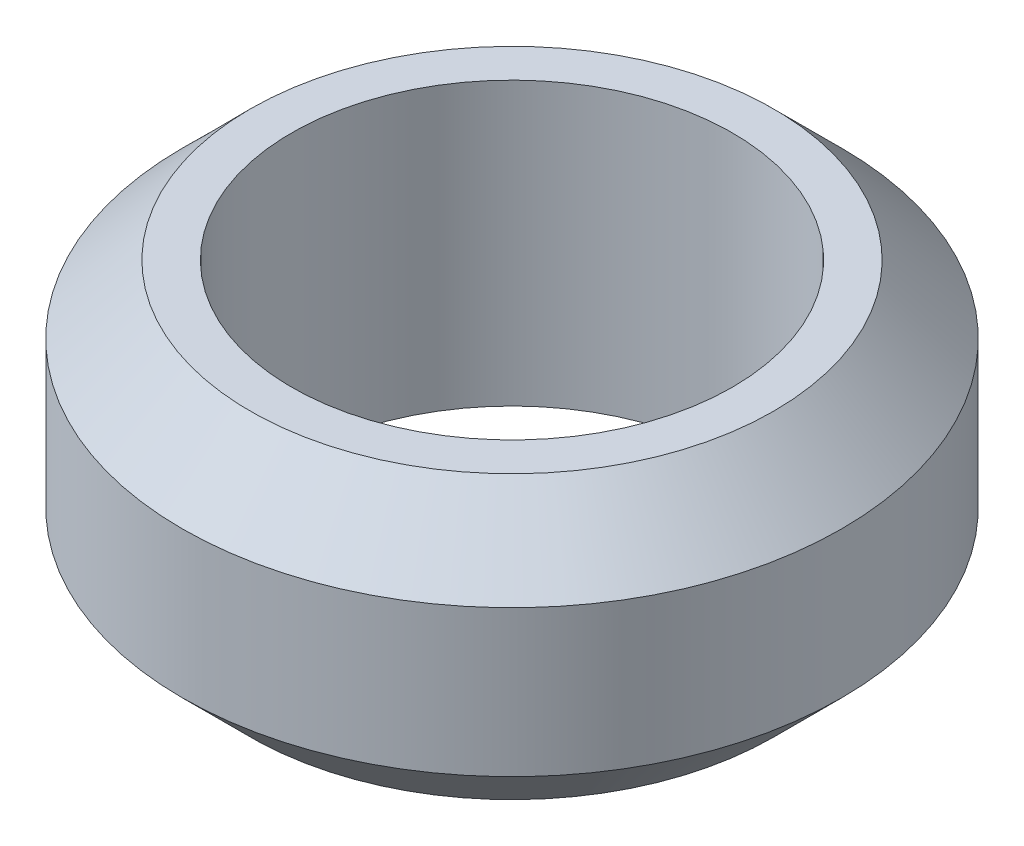
ISO-10303-21;
HEADER;
FILE_DESCRIPTION(('STEP AP214'),'2;1');
FILE_NAME('part.step','',(''),(''),'','','');
FILE_SCHEMA(('AUTOMOTIVE_DESIGN { 1 0 10303 214 1 1 1 1 }'));
ENDSEC;
DATA;
#1=APPLICATION_CONTEXT('core data for automotive mechanical design processes');
#2=APPLICATION_PROTOCOL_DEFINITION('international standard','automotive_design',2000,#1);
#3=PRODUCT_CONTEXT('',#1,'mechanical');
#4=PRODUCT('Part','Part','',(#3));
#5=PRODUCT_RELATED_PRODUCT_CATEGORY('part','',(#4));
#6=PRODUCT_DEFINITION_FORMATION('','',#4);
#7=PRODUCT_DEFINITION_CONTEXT('part definition',#1,'design');
#8=PRODUCT_DEFINITION('design','',#6,#7);
#9=PRODUCT_DEFINITION_SHAPE('','',#8);
#10=(LENGTH_UNIT() NAMED_UNIT(*) SI_UNIT(.MILLI.,.METRE.));
#11=(NAMED_UNIT(*) PLANE_ANGLE_UNIT() SI_UNIT($,.RADIAN.));
#12=(NAMED_UNIT(*) SI_UNIT($,.STERADIAN.) SOLID_ANGLE_UNIT());
#13=UNCERTAINTY_MEASURE_WITH_UNIT(LENGTH_MEASURE(1.E-05),#10,'distance_accuracy_value','');
#14=(GEOMETRIC_REPRESENTATION_CONTEXT(3) GLOBAL_UNCERTAINTY_ASSIGNED_CONTEXT((#13)) GLOBAL_UNIT_ASSIGNED_CONTEXT((#10,
#11,#12)) REPRESENTATION_CONTEXT('',''));
#15=CARTESIAN_POINT('',(0.,0.,0.));
#16=DIRECTION('',(0.,0.,1.));
#17=DIRECTION('',(1.,0.,0.));
#18=AXIS2_PLACEMENT_3D('',#15,#16,#17);
#19=CARTESIAN_POINT('',(7.987,0.,0.));
#20=DIRECTION('',(0.,-1.,0.));
#21=DIRECTION('',(0.,0.,-1.));
#22=AXIS2_PLACEMENT_3D('',#19,#20,#21);
#23=PLANE('',#22);
#24=CARTESIAN_POINT('',(0.,0.,0.));
#25=DIRECTION('',(0.,-1.,0.));
#26=DIRECTION('',(1.,0.,0.));
#27=AXIS2_PLACEMENT_3D('',#24,#25,#26);
#28=CIRCLE('',#27,7.987);
#29=CARTESIAN_POINT('',(7.987,0.,0.));
#30=VERTEX_POINT('',#29);
#31=EDGE_CURVE('E59',#30,#30,#28,.T.);
#32=ORIENTED_EDGE('',*,*,#31,.F.);
#33=EDGE_LOOP('',(#32));
#34=FACE_BOUND('',#33,.T.);
#35=CARTESIAN_POINT('',(0.,0.,0.));
#36=DIRECTION('',(0.,-1.,0.));
#37=DIRECTION('',(1.,0.,0.));
#38=AXIS2_PLACEMENT_3D('',#35,#36,#37);
#39=CIRCLE('',#38,9.487);
#40=CARTESIAN_POINT('',(9.487,0.,0.));
#41=VERTEX_POINT('',#40);
#42=EDGE_CURVE('E11',#41,#41,#39,.T.);
#43=ORIENTED_EDGE('',*,*,#42,.T.);
#44=EDGE_LOOP('',(#43));
#45=FACE_BOUND('',#44,.T.);
#46=ADVANCED_FACE('F17',(#34,#45),#23,.T.);
#47=CARTESIAN_POINT('',(0.,1.2315,0.));
#48=DIRECTION('',(0.,1.,0.));
#49=DIRECTION('',(1.,0.,0.));
#50=AXIS2_PLACEMENT_3D('',#47,#48,#49);
#51=CONICAL_SURFACE('',#50,10.7185,0.7853981634);
#52=ORIENTED_EDGE('',*,*,#42,.F.);
#53=EDGE_LOOP('',(#52));
#54=FACE_BOUND('',#53,.T.);
#55=CARTESIAN_POINT('',(0.,2.463,0.));
#56=DIRECTION('',(0.,-1.,0.));
#57=DIRECTION('',(1.,0.,0.));
#58=AXIS2_PLACEMENT_3D('',#55,#56,#57);
#59=CIRCLE('',#58,11.95);
#60=CARTESIAN_POINT('',(11.95,2.463,0.));
#61=VERTEX_POINT('',#60);
#62=EDGE_CURVE('E21',#61,#61,#59,.T.);
#63=ORIENTED_EDGE('',*,*,#62,.T.);
#64=EDGE_LOOP('',(#63));
#65=FACE_BOUND('',#64,.T.);
#66=ADVANCED_FACE('F99',(#54,#65),#51,.T.);
#67=CARTESIAN_POINT('',(0.,5.115,0.));
#68=DIRECTION('',(0.,-1.,0.));
#69=DIRECTION('',(1.,0.,0.));
#70=AXIS2_PLACEMENT_3D('',#67,#68,#69);
#71=CYLINDRICAL_SURFACE('',#70,11.95);
#72=ORIENTED_EDGE('',*,*,#62,.F.);
#73=EDGE_LOOP('',(#72));
#74=FACE_BOUND('',#73,.T.);
#75=CARTESIAN_POINT('',(0.,7.767,0.));
#76=DIRECTION('',(0.,-1.,0.));
#77=DIRECTION('',(1.,0.,0.));
#78=AXIS2_PLACEMENT_3D('',#75,#76,#77);
#79=CIRCLE('',#78,11.95);
#80=CARTESIAN_POINT('',(11.95,7.767,0.));
#81=VERTEX_POINT('',#80);
#82=EDGE_CURVE('E73',#81,#81,#79,.T.);
#83=ORIENTED_EDGE('',*,*,#82,.T.);
#84=EDGE_LOOP('',(#83));
#85=FACE_BOUND('',#84,.T.);
#86=ADVANCED_FACE('F105',(#74,#85),#71,.T.);
#87=CARTESIAN_POINT('',(0.,8.9985,0.));
#88=DIRECTION('',(0.,-1.,0.));
#89=DIRECTION('',(1.,0.,0.));
#90=AXIS2_PLACEMENT_3D('',#87,#88,#89);
#91=CONICAL_SURFACE('',#90,10.7185,0.7853981634);
#92=ORIENTED_EDGE('',*,*,#82,.F.);
#93=EDGE_LOOP('',(#92));
#94=FACE_BOUND('',#93,.T.);
#95=CARTESIAN_POINT('',(0.,10.23,0.));
#96=DIRECTION('',(0.,-1.,0.));
#97=DIRECTION('',(1.,0.,0.));
#98=AXIS2_PLACEMENT_3D('',#95,#96,#97);
#99=CIRCLE('',#98,9.487);
#100=CARTESIAN_POINT('',(9.487,10.23,0.));
#101=VERTEX_POINT('',#100);
#102=EDGE_CURVE('E69',#101,#101,#99,.T.);
#103=ORIENTED_EDGE('',*,*,#102,.T.);
#104=EDGE_LOOP('',(#103));
#105=FACE_BOUND('',#104,.T.);
#106=ADVANCED_FACE('F19',(#94,#105),#91,.T.);
#107=CARTESIAN_POINT('',(9.487,10.23,0.));
#108=DIRECTION('',(0.,1.,0.));
#109=DIRECTION('',(1.,0.,0.));
#110=AXIS2_PLACEMENT_3D('',#107,#108,#109);
#111=PLANE('',#110);
#112=ORIENTED_EDGE('',*,*,#102,.F.);
#113=EDGE_LOOP('',(#112));
#114=FACE_BOUND('',#113,.T.);
#115=CARTESIAN_POINT('',(0.,10.23,0.));
#116=DIRECTION('',(0.,-1.,0.));
#117=DIRECTION('',(1.,0.,0.));
#118=AXIS2_PLACEMENT_3D('',#115,#116,#117);
#119=CIRCLE('',#118,7.987);
#120=CARTESIAN_POINT('',(7.987,10.23,0.));
#121=VERTEX_POINT('',#120);
#122=EDGE_CURVE('E63',#121,#121,#119,.T.);
#123=ORIENTED_EDGE('',*,*,#122,.T.);
#124=EDGE_LOOP('',(#123));
#125=FACE_BOUND('',#124,.T.);
#126=ADVANCED_FACE('F86',(#114,#125),#111,.T.);
#127=CARTESIAN_POINT('',(0.,5.115,0.));
#128=DIRECTION('',(0.,-1.,0.));
#129=DIRECTION('',(1.,0.,0.));
#130=AXIS2_PLACEMENT_3D('',#127,#128,#129);
#131=CYLINDRICAL_SURFACE('',#130,7.987);
#132=ORIENTED_EDGE('',*,*,#122,.F.);
#133=EDGE_LOOP('',(#132));
#134=FACE_BOUND('',#133,.T.);
#135=ORIENTED_EDGE('',*,*,#31,.T.);
#136=EDGE_LOOP('',(#135));
#137=FACE_BOUND('',#136,.T.);
#138=ADVANCED_FACE('F60',(#134,#137),#131,.F.);
#139=CLOSED_SHELL('',(#46,#66,#86,#106,#126,#138));
#140=MANIFOLD_SOLID_BREP('B1',#139);
#141=ADVANCED_BREP_SHAPE_REPRESENTATION('',(#18,#140),#14);
#142=SHAPE_DEFINITION_REPRESENTATION(#9,#141);
ENDSEC;
END-ISO-10303-21;
